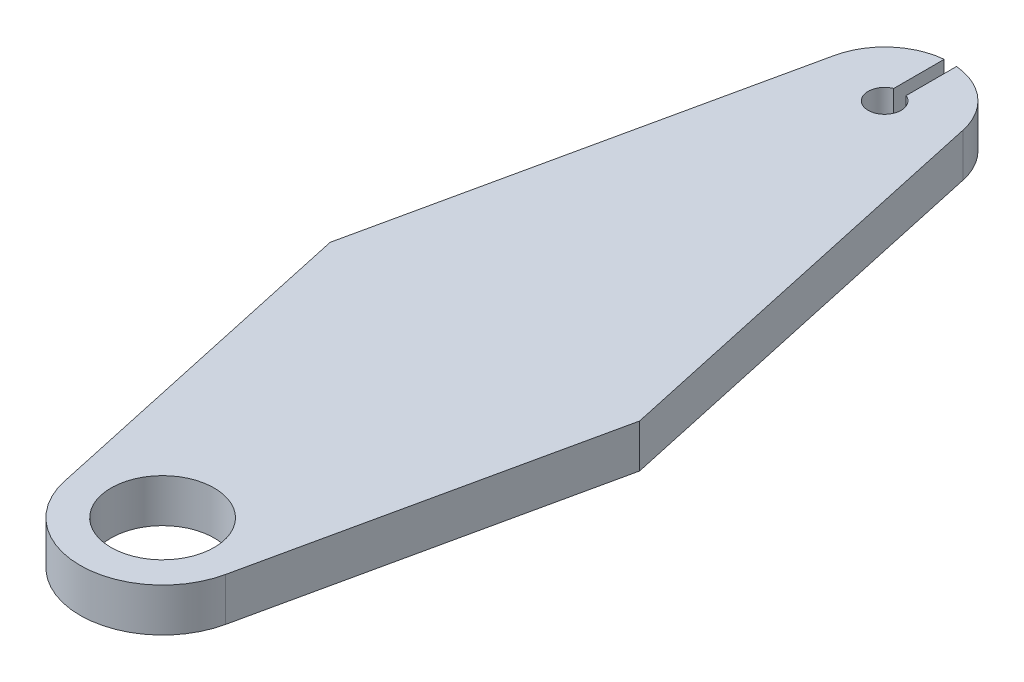
ISO-10303-21;
HEADER;
FILE_DESCRIPTION(('STEP AP214'),'2;1');
FILE_NAME('part.step','',(''),(''),'','','');
FILE_SCHEMA(('AUTOMOTIVE_DESIGN { 1 0 10303 214 1 1 1 1 }'));
ENDSEC;
DATA;
#1=APPLICATION_CONTEXT('core data for automotive mechanical design processes');
#2=APPLICATION_PROTOCOL_DEFINITION('international standard','automotive_design',2000,#1);
#3=PRODUCT_CONTEXT('',#1,'mechanical');
#4=PRODUCT('Part','Part','',(#3));
#5=PRODUCT_RELATED_PRODUCT_CATEGORY('part','',(#4));
#6=PRODUCT_DEFINITION_FORMATION('','',#4);
#7=PRODUCT_DEFINITION_CONTEXT('part definition',#1,'design');
#8=PRODUCT_DEFINITION('design','',#6,#7);
#9=PRODUCT_DEFINITION_SHAPE('','',#8);
#10=(LENGTH_UNIT() NAMED_UNIT(*) SI_UNIT(.MILLI.,.METRE.));
#11=(NAMED_UNIT(*) PLANE_ANGLE_UNIT() SI_UNIT($,.RADIAN.));
#12=(NAMED_UNIT(*) SI_UNIT($,.STERADIAN.) SOLID_ANGLE_UNIT());
#13=UNCERTAINTY_MEASURE_WITH_UNIT(LENGTH_MEASURE(1.E-05),#10,'distance_accuracy_value','');
#14=(GEOMETRIC_REPRESENTATION_CONTEXT(3) GLOBAL_UNCERTAINTY_ASSIGNED_CONTEXT((#13)) GLOBAL_UNIT_ASSIGNED_CONTEXT((#10,
#11,#12)) REPRESENTATION_CONTEXT('',''));
#15=CARTESIAN_POINT('',(0.,0.,0.));
#16=DIRECTION('',(0.,0.,1.));
#17=DIRECTION('',(1.,0.,0.));
#18=AXIS2_PLACEMENT_3D('',#15,#16,#17);
#19=CARTESIAN_POINT('',(100.,22.5,0.));
#20=DIRECTION('',(0.,1.,0.));
#21=DIRECTION('',(0.,0.,1.));
#22=AXIS2_PLACEMENT_3D('',#19,#20,#21);
#23=PLANE('',#22);
#24=CARTESIAN_POINT('',(100.,22.5,370.));
#25=DIRECTION('',(0.,-1.,0.));
#26=DIRECTION('',(0.,0.,-1.));
#27=AXIS2_PLACEMENT_3D('',#24,#25,#26);
#28=CIRCLE('',#27,12.5);
#29=CARTESIAN_POINT('',(100.,22.5,382.5));
#30=VERTEX_POINT('',#29);
#31=EDGE_CURVE('E135',#30,#30,#28,.T.);
#32=ORIENTED_EDGE('',*,*,#31,.F.);
#33=EDGE_LOOP('',(#32));
#34=FACE_BOUND('',#33,.T.);
#35=DIRECTION('',(0.,0.,1.));
#36=VECTOR('',#35,1.);
#37=CARTESIAN_POINT('',(98.5,22.5,0.));
#38=LINE('',#37,#36);
#39=CARTESIAN_POINT('',(98.5,22.5,179.070467677926));
#40=VERTEX_POINT('',#39);
#41=CARTESIAN_POINT('',(98.5,22.5,191.291900756452));
#42=VERTEX_POINT('',#41);
#43=EDGE_CURVE('E58',#40,#42,#38,.T.);
#44=ORIENTED_EDGE('',*,*,#43,.T.);
#45=CARTESIAN_POINT('',(100.,22.5,195.));
#46=DIRECTION('',(0.,-1.,0.));
#47=DIRECTION('',(0.,0.,-1.));
#48=AXIS2_PLACEMENT_3D('',#45,#46,#47);
#49=CIRCLE('',#48,4.);
#50=CARTESIAN_POINT('',(101.5,22.5,191.291900756452));
#51=VERTEX_POINT('',#50);
#52=EDGE_CURVE('E125',#51,#42,#49,.T.);
#53=ORIENTED_EDGE('',*,*,#52,.F.);
#54=DIRECTION('',(0.,0.,1.));
#55=VECTOR('',#54,1.);
#56=CARTESIAN_POINT('',(101.5,22.5,0.));
#57=LINE('',#56,#55);
#58=CARTESIAN_POINT('',(101.5,22.5,179.070467677926));
#59=VERTEX_POINT('',#58);
#60=EDGE_CURVE('E109',#59,#51,#57,.T.);
#61=ORIENTED_EDGE('',*,*,#60,.F.);
#62=CARTESIAN_POINT('',(100.,22.5,195.));
#63=DIRECTION('',(0.,1.,0.));
#64=DIRECTION('',(0.,0.,1.));
#65=AXIS2_PLACEMENT_3D('',#62,#63,#64);
#66=CIRCLE('',#65,16.);
#67=CARTESIAN_POINT('',(115.632763820398,22.5,191.591672648401));
#68=VERTEX_POINT('',#67);
#69=EDGE_CURVE('E172',#59,#68,#66,.F.);
#70=ORIENTED_EDGE('',*,*,#69,.T.);
#71=DIRECTION('',(0.213020459474943,0.,0.977047738774869));
#72=VECTOR('',#71,1.);
#73=CARTESIAN_POINT('',(137.5,22.5,291.888769533826));
#74=LINE('',#73,#72);
#75=CARTESIAN_POINT('',(137.5,22.5,291.888769533826));
#76=VERTEX_POINT('',#75);
#77=EDGE_CURVE('E140',#68,#76,#74,.T.);
#78=ORIENTED_EDGE('',*,*,#77,.T.);
#79=DIRECTION('',(-0.213020459474944,0.,0.977047738774869));
#80=VECTOR('',#79,1.);
#81=CARTESIAN_POINT('',(100.,22.5,463.887695338262));
#82=LINE('',#81,#80);
#83=CARTESIAN_POINT('',(119.540954775497,22.5,374.260409189499));
#84=VERTEX_POINT('',#83);
#85=EDGE_CURVE('E142',#76,#84,#82,.T.);
#86=ORIENTED_EDGE('',*,*,#85,.T.);
#87=CARTESIAN_POINT('',(100.,22.5,370.));
#88=DIRECTION('',(0.,1.,0.));
#89=DIRECTION('',(0.,0.,1.));
#90=AXIS2_PLACEMENT_3D('',#87,#88,#89);
#91=CIRCLE('',#90,20.);
#92=CARTESIAN_POINT('',(80.4590452245026,22.5,374.260409189499));
#93=VERTEX_POINT('',#92);
#94=EDGE_CURVE('E11',#84,#93,#91,.F.);
#95=ORIENTED_EDGE('',*,*,#94,.T.);
#96=DIRECTION('',(-0.213020459474943,0.,-0.977047738774869));
#97=VECTOR('',#96,1.);
#98=CARTESIAN_POINT('',(62.5,22.5,291.888769533826));
#99=LINE('',#98,#97);
#100=CARTESIAN_POINT('',(62.5,22.5,291.888769533826));
#101=VERTEX_POINT('',#100);
#102=EDGE_CURVE('E146',#93,#101,#99,.T.);
#103=ORIENTED_EDGE('',*,*,#102,.T.);
#104=DIRECTION('',(0.213020459474944,0.,-0.977047738774869));
#105=VECTOR('',#104,1.);
#106=CARTESIAN_POINT('',(100.,22.5,119.889843729391));
#107=LINE('',#106,#105);
#108=CARTESIAN_POINT('',(84.3672361796021,22.5,191.591672648401));
#109=VERTEX_POINT('',#108);
#110=EDGE_CURVE('E148',#101,#109,#107,.T.);
#111=ORIENTED_EDGE('',*,*,#110,.T.);
#112=EDGE_CURVE('E173',#109,#40,#66,.F.);
#113=ORIENTED_EDGE('',*,*,#112,.T.);
#114=EDGE_LOOP('',(#44,#53,#61,#70,#78,#86,#95,#103,#111,#113));
#115=FACE_BOUND('',#114,.T.);
#116=ADVANCED_FACE('F35',(#34,#115),#23,.F.);
#117=CARTESIAN_POINT('',(100.,33.,0.));
#118=DIRECTION('',(0.,1.,0.));
#119=DIRECTION('',(0.,0.,1.));
#120=AXIS2_PLACEMENT_3D('',#117,#118,#119);
#121=PLANE('',#120);
#122=CARTESIAN_POINT('',(100.,33.,370.));
#123=DIRECTION('',(0.,-1.,0.));
#124=DIRECTION('',(0.,0.,-1.));
#125=AXIS2_PLACEMENT_3D('',#122,#123,#124);
#126=CIRCLE('',#125,12.5);
#127=CARTESIAN_POINT('',(100.,33.,382.5));
#128=VERTEX_POINT('',#127);
#129=EDGE_CURVE('E117',#128,#128,#126,.T.);
#130=ORIENTED_EDGE('',*,*,#129,.T.);
#131=EDGE_LOOP('',(#130));
#132=FACE_BOUND('',#131,.T.);
#133=CARTESIAN_POINT('',(100.,33.,195.));
#134=DIRECTION('',(0.,-1.,0.));
#135=DIRECTION('',(0.,0.,-1.));
#136=AXIS2_PLACEMENT_3D('',#133,#134,#135);
#137=CIRCLE('',#136,4.);
#138=CARTESIAN_POINT('',(101.5,33.,191.291900756452));
#139=VERTEX_POINT('',#138);
#140=CARTESIAN_POINT('',(98.5,33.,191.291900756452));
#141=VERTEX_POINT('',#140);
#142=EDGE_CURVE('E127',#139,#141,#137,.T.);
#143=ORIENTED_EDGE('',*,*,#142,.T.);
#144=DIRECTION('',(0.,0.,-1.));
#145=VECTOR('',#144,1.);
#146=CARTESIAN_POINT('',(98.5,33.,0.));
#147=LINE('',#146,#145);
#148=CARTESIAN_POINT('',(98.5,33.,179.070467677926));
#149=VERTEX_POINT('',#148);
#150=EDGE_CURVE('E128',#141,#149,#147,.T.);
#151=ORIENTED_EDGE('',*,*,#150,.T.);
#152=CARTESIAN_POINT('',(100.,33.,195.));
#153=DIRECTION('',(0.,1.,0.));
#154=DIRECTION('',(0.,0.,1.));
#155=AXIS2_PLACEMENT_3D('',#152,#153,#154);
#156=CIRCLE('',#155,16.);
#157=CARTESIAN_POINT('',(84.3672361796021,33.,191.591672648401));
#158=VERTEX_POINT('',#157);
#159=EDGE_CURVE('E166',#149,#158,#156,.T.);
#160=ORIENTED_EDGE('',*,*,#159,.T.);
#161=DIRECTION('',(0.213020459474944,0.,-0.977047738774869));
#162=VECTOR('',#161,1.);
#163=CARTESIAN_POINT('',(100.,33.,119.889843729391));
#164=LINE('',#163,#162);
#165=CARTESIAN_POINT('',(62.5,33.,291.888769533826));
#166=VERTEX_POINT('',#165);
#167=EDGE_CURVE('E143',#166,#158,#164,.T.);
#168=ORIENTED_EDGE('',*,*,#167,.F.);
#169=DIRECTION('',(-0.213020459474943,0.,-0.977047738774869));
#170=VECTOR('',#169,1.);
#171=CARTESIAN_POINT('',(62.5,33.,291.888769533826));
#172=LINE('',#171,#170);
#173=CARTESIAN_POINT('',(80.4590452245026,33.,374.260409189499));
#174=VERTEX_POINT('',#173);
#175=EDGE_CURVE('E154',#174,#166,#172,.T.);
#176=ORIENTED_EDGE('',*,*,#175,.F.);
#177=CARTESIAN_POINT('',(100.,33.,370.));
#178=DIRECTION('',(0.,1.,0.));
#179=DIRECTION('',(0.,0.,1.));
#180=AXIS2_PLACEMENT_3D('',#177,#178,#179);
#181=CIRCLE('',#180,20.);
#182=CARTESIAN_POINT('',(119.540954775497,33.,374.260409189499));
#183=VERTEX_POINT('',#182);
#184=EDGE_CURVE('E178',#174,#183,#181,.T.);
#185=ORIENTED_EDGE('',*,*,#184,.T.);
#186=DIRECTION('',(-0.213020459474944,0.,0.977047738774869));
#187=VECTOR('',#186,1.);
#188=CARTESIAN_POINT('',(100.,33.,463.887695338262));
#189=LINE('',#188,#187);
#190=CARTESIAN_POINT('',(137.5,33.,291.888769533826));
#191=VERTEX_POINT('',#190);
#192=EDGE_CURVE('E133',#191,#183,#189,.T.);
#193=ORIENTED_EDGE('',*,*,#192,.F.);
#194=DIRECTION('',(0.213020459474943,0.,0.977047738774869));
#195=VECTOR('',#194,1.);
#196=CARTESIAN_POINT('',(137.5,33.,291.888769533826));
#197=LINE('',#196,#195);
#198=CARTESIAN_POINT('',(115.632763820398,33.,191.591672648401));
#199=VERTEX_POINT('',#198);
#200=EDGE_CURVE('E131',#199,#191,#197,.T.);
#201=ORIENTED_EDGE('',*,*,#200,.F.);
#202=CARTESIAN_POINT('',(101.5,33.,179.070467677926));
#203=VERTEX_POINT('',#202);
#204=EDGE_CURVE('E167',#199,#203,#156,.T.);
#205=ORIENTED_EDGE('',*,*,#204,.T.);
#206=DIRECTION('',(0.,0.,-1.));
#207=VECTOR('',#206,1.);
#208=CARTESIAN_POINT('',(101.5,33.,0.));
#209=LINE('',#208,#207);
#210=EDGE_CURVE('E50',#139,#203,#209,.T.);
#211=ORIENTED_EDGE('',*,*,#210,.F.);
#212=EDGE_LOOP('',(#143,#151,#160,#168,#176,#185,#193,#201,#205,#211));
#213=FACE_BOUND('',#212,.T.);
#214=ADVANCED_FACE('F196',(#132,#213),#121,.T.);
#215=CARTESIAN_POINT('',(100.,22.5,195.));
#216=DIRECTION('',(0.,1.,0.));
#217=DIRECTION('',(0.,0.,1.));
#218=AXIS2_PLACEMENT_3D('',#215,#216,#217);
#219=CYLINDRICAL_SURFACE('',#218,4.);
#220=ORIENTED_EDGE('',*,*,#52,.T.);
#221=DIRECTION('',(0.,1.,0.));
#222=VECTOR('',#221,1.);
#223=CARTESIAN_POINT('',(98.5,-12.001,191.291900756452));
#224=LINE('',#223,#222);
#225=EDGE_CURVE('E118',#42,#141,#224,.T.);
#226=ORIENTED_EDGE('',*,*,#225,.T.);
#227=ORIENTED_EDGE('',*,*,#142,.F.);
#228=DIRECTION('',(0.,1.,0.));
#229=VECTOR('',#228,1.);
#230=CARTESIAN_POINT('',(101.5,-12.001,191.291900756452));
#231=LINE('',#230,#229);
#232=EDGE_CURVE('E112',#51,#139,#231,.T.);
#233=ORIENTED_EDGE('',*,*,#232,.F.);
#234=EDGE_LOOP('',(#220,#226,#227,#233));
#235=FACE_BOUND('',#234,.T.);
#236=ADVANCED_FACE('F123',(#235),#219,.F.);
#237=CARTESIAN_POINT('',(100.,22.5,195.));
#238=DIRECTION('',(0.,1.,0.));
#239=DIRECTION('',(0.,0.,1.));
#240=AXIS2_PLACEMENT_3D('',#237,#238,#239);
#241=CYLINDRICAL_SURFACE('',#240,16.);
#242=ORIENTED_EDGE('',*,*,#159,.F.);
#243=DIRECTION('',(0.,1.,0.));
#244=VECTOR('',#243,1.);
#245=CARTESIAN_POINT('',(98.5,-12.001,179.070467677926));
#246=LINE('',#245,#244);
#247=EDGE_CURVE('E206',#40,#149,#246,.T.);
#248=ORIENTED_EDGE('',*,*,#247,.F.);
#249=ORIENTED_EDGE('',*,*,#112,.F.);
#250=DIRECTION('',(0.,1.,0.));
#251=VECTOR('',#250,1.);
#252=CARTESIAN_POINT('',(84.3672361796021,22.5,191.591672648401));
#253=LINE('',#252,#251);
#254=EDGE_CURVE('E170',#158,#109,#253,.F.);
#255=ORIENTED_EDGE('',*,*,#254,.F.);
#256=EDGE_LOOP('',(#242,#248,#249,#255));
#257=FACE_BOUND('',#256,.T.);
#258=ADVANCED_FACE('F205',(#257),#241,.T.);
#259=CARTESIAN_POINT('',(137.5,22.5,291.888769533826));
#260=DIRECTION('',(-0.977047738774869,0.,0.213020459474943));
#261=DIRECTION('',(0.213020459474944,0.,0.977047738774869));
#262=AXIS2_PLACEMENT_3D('',#259,#260,#261);
#263=PLANE('',#262);
#264=ORIENTED_EDGE('',*,*,#77,.F.);
#265=DIRECTION('',(0.,1.,0.));
#266=VECTOR('',#265,1.);
#267=CARTESIAN_POINT('',(115.632763820398,22.5,191.591672648401));
#268=LINE('',#267,#266);
#269=EDGE_CURVE('E163',#68,#199,#268,.T.);
#270=ORIENTED_EDGE('',*,*,#269,.T.);
#271=ORIENTED_EDGE('',*,*,#200,.T.);
#272=DIRECTION('',(0.,1.,0.));
#273=VECTOR('',#272,1.);
#274=CARTESIAN_POINT('',(137.5,22.5,291.888769533826));
#275=LINE('',#274,#273);
#276=EDGE_CURVE('E160',#76,#191,#275,.T.);
#277=ORIENTED_EDGE('',*,*,#276,.F.);
#278=EDGE_LOOP('',(#264,#270,#271,#277));
#279=FACE_BOUND('',#278,.T.);
#280=ADVANCED_FACE('F242',(#279),#263,.F.);
#281=CARTESIAN_POINT('',(100.,22.5,463.887695338262));
#282=DIRECTION('',(-0.977047738774869,0.,-0.213020459474944));
#283=DIRECTION('',(-0.213020459474944,0.,0.977047738774869));
#284=AXIS2_PLACEMENT_3D('',#281,#282,#283);
#285=PLANE('',#284);
#286=ORIENTED_EDGE('',*,*,#192,.T.);
#287=DIRECTION('',(0.,1.,0.));
#288=VECTOR('',#287,1.);
#289=CARTESIAN_POINT('',(119.540954775497,22.5,374.260409189499));
#290=LINE('',#289,#288);
#291=EDGE_CURVE('E43',#183,#84,#290,.F.);
#292=ORIENTED_EDGE('',*,*,#291,.T.);
#293=ORIENTED_EDGE('',*,*,#85,.F.);
#294=ORIENTED_EDGE('',*,*,#276,.T.);
#295=EDGE_LOOP('',(#286,#292,#293,#294));
#296=FACE_BOUND('',#295,.T.);
#297=ADVANCED_FACE('F182',(#296),#285,.F.);
#298=CARTESIAN_POINT('',(62.5,22.5,291.888769533826));
#299=DIRECTION('',(0.977047738774869,0.,-0.213020459474943));
#300=DIRECTION('',(-0.213020459474944,0.,-0.977047738774869));
#301=AXIS2_PLACEMENT_3D('',#298,#299,#300);
#302=PLANE('',#301);
#303=ORIENTED_EDGE('',*,*,#102,.F.);
#304=DIRECTION('',(0.,1.,0.));
#305=VECTOR('',#304,1.);
#306=CARTESIAN_POINT('',(80.4590452245026,22.5,374.260409189499));
#307=LINE('',#306,#305);
#308=EDGE_CURVE('E175',#93,#174,#307,.T.);
#309=ORIENTED_EDGE('',*,*,#308,.T.);
#310=ORIENTED_EDGE('',*,*,#175,.T.);
#311=DIRECTION('',(0.,1.,0.));
#312=VECTOR('',#311,1.);
#313=CARTESIAN_POINT('',(62.5,22.5,291.888769533826));
#314=LINE('',#313,#312);
#315=EDGE_CURVE('E150',#101,#166,#314,.T.);
#316=ORIENTED_EDGE('',*,*,#315,.F.);
#317=EDGE_LOOP('',(#303,#309,#310,#316));
#318=FACE_BOUND('',#317,.T.);
#319=ADVANCED_FACE('F192',(#318),#302,.F.);
#320=CARTESIAN_POINT('',(100.,22.5,119.889843729391));
#321=DIRECTION('',(0.977047738774869,0.,0.213020459474944));
#322=DIRECTION('',(0.213020459474944,0.,-0.977047738774869));
#323=AXIS2_PLACEMENT_3D('',#320,#321,#322);
#324=PLANE('',#323);
#325=ORIENTED_EDGE('',*,*,#167,.T.);
#326=ORIENTED_EDGE('',*,*,#254,.T.);
#327=ORIENTED_EDGE('',*,*,#110,.F.);
#328=ORIENTED_EDGE('',*,*,#315,.T.);
#329=EDGE_LOOP('',(#325,#326,#327,#328));
#330=FACE_BOUND('',#329,.T.);
#331=ADVANCED_FACE('F201',(#330),#324,.F.);
#332=CARTESIAN_POINT('',(100.,22.5,370.));
#333=DIRECTION('',(0.,1.,0.));
#334=DIRECTION('',(0.,0.,1.));
#335=AXIS2_PLACEMENT_3D('',#332,#333,#334);
#336=CYLINDRICAL_SURFACE('',#335,12.5);
#337=CARTESIAN_POINT('',(100.,22.5,382.5));
#338=CARTESIAN_POINT('',(100.,22.609375,382.5));
#339=CARTESIAN_POINT('',(100.,22.71875,382.5));
#340=CARTESIAN_POINT('',(100.,22.9375,382.5));
#341=CARTESIAN_POINT('',(100.,23.046875,382.5));
#342=CARTESIAN_POINT('',(100.,23.265625,382.5));
#343=CARTESIAN_POINT('',(100.,23.375,382.5));
#344=CARTESIAN_POINT('',(100.,23.59375,382.5));
#345=CARTESIAN_POINT('',(100.,23.703125,382.5));
#346=CARTESIAN_POINT('',(100.,23.921875,382.5));
#347=CARTESIAN_POINT('',(100.,24.03125,382.5));
#348=CARTESIAN_POINT('',(100.,24.25,382.5));
#349=CARTESIAN_POINT('',(100.,24.359375,382.5));
#350=CARTESIAN_POINT('',(100.,24.578125,382.5));
#351=CARTESIAN_POINT('',(100.,24.6875,382.5));
#352=CARTESIAN_POINT('',(100.,24.90625,382.5));
#353=CARTESIAN_POINT('',(100.,25.015625,382.5));
#354=CARTESIAN_POINT('',(100.,25.234375,382.5));
#355=CARTESIAN_POINT('',(100.,25.34375,382.5));
#356=CARTESIAN_POINT('',(100.,25.5625,382.5));
#357=CARTESIAN_POINT('',(100.,25.671875,382.5));
#358=CARTESIAN_POINT('',(100.,25.890625,382.5));
#359=CARTESIAN_POINT('',(100.,26.,382.5));
#360=CARTESIAN_POINT('',(100.,26.21875,382.5));
#361=CARTESIAN_POINT('',(100.,26.328125,382.5));
#362=CARTESIAN_POINT('',(100.,26.546875,382.5));
#363=CARTESIAN_POINT('',(100.,26.65625,382.5));
#364=CARTESIAN_POINT('',(100.,26.875,382.5));
#365=CARTESIAN_POINT('',(100.,26.984375,382.5));
#366=CARTESIAN_POINT('',(100.,27.203125,382.5));
#367=CARTESIAN_POINT('',(100.,27.3125,382.5));
#368=CARTESIAN_POINT('',(100.,27.53125,382.5));
#369=CARTESIAN_POINT('',(100.,27.640625,382.5));
#370=CARTESIAN_POINT('',(100.,27.859375,382.5));
#371=CARTESIAN_POINT('',(100.,27.96875,382.5));
#372=CARTESIAN_POINT('',(100.,28.1875,382.5));
#373=CARTESIAN_POINT('',(100.,28.296875,382.5));
#374=CARTESIAN_POINT('',(100.,28.515625,382.5));
#375=CARTESIAN_POINT('',(100.,28.625,382.5));
#376=CARTESIAN_POINT('',(100.,28.84375,382.5));
#377=CARTESIAN_POINT('',(100.,28.953125,382.5));
#378=CARTESIAN_POINT('',(100.,29.171875,382.5));
#379=CARTESIAN_POINT('',(100.,29.28125,382.5));
#380=CARTESIAN_POINT('',(100.,29.5,382.5));
#381=CARTESIAN_POINT('',(100.,29.609375,382.5));
#382=CARTESIAN_POINT('',(100.,29.828125,382.5));
#383=CARTESIAN_POINT('',(100.,29.9375,382.5));
#384=CARTESIAN_POINT('',(100.,30.15625,382.5));
#385=CARTESIAN_POINT('',(100.,30.265625,382.5));
#386=CARTESIAN_POINT('',(100.,30.484375,382.5));
#387=CARTESIAN_POINT('',(100.,30.59375,382.5));
#388=CARTESIAN_POINT('',(100.,30.8125,382.5));
#389=CARTESIAN_POINT('',(100.,30.921875,382.5));
#390=CARTESIAN_POINT('',(100.,31.140625,382.5));
#391=CARTESIAN_POINT('',(100.,31.25,382.5));
#392=CARTESIAN_POINT('',(100.,31.46875,382.5));
#393=CARTESIAN_POINT('',(100.,31.578125,382.5));
#394=CARTESIAN_POINT('',(100.,31.796875,382.5));
#395=CARTESIAN_POINT('',(100.,31.90625,382.5));
#396=CARTESIAN_POINT('',(100.,32.125,382.5));
#397=CARTESIAN_POINT('',(100.,32.234375,382.5));
#398=CARTESIAN_POINT('',(100.,32.453125,382.5));
#399=CARTESIAN_POINT('',(100.,32.5625,382.5));
#400=CARTESIAN_POINT('',(100.,32.78125,382.5));
#401=CARTESIAN_POINT('',(100.,32.890625,382.5));
#402=CARTESIAN_POINT('',(100.,33.,382.5));
#403=B_SPLINE_CURVE_WITH_KNOTS('',3,(#337,#338,#339,#340,#341,#342,#343,#344,#345,#346,#347,
#348,#349,#350,#351,#352,#353,#354,#355,#356,#357,#358,#359,#360,#361,#362,#363,#364,#365,#366,
#367,#368,#369,#370,#371,#372,#373,#374,#375,#376,#377,#378,#379,#380,#381,#382,#383,#384,#385,
#386,#387,#388,#389,#390,#391,#392,#393,#394,#395,#396,#397,#398,#399,#400,#401,#402),
.UNSPECIFIED.,.F.,.F.,(4,2,2,2,2,2,2,2,2,2,2,2,2,2,2,2,2,2,2,2,2,2,2,2,2,2,2,2,2,2,2,2,4),(0.,
0.328124999999999,0.656249999999997,0.984374999999999,1.3125,1.640625,1.96875,2.296875,2.625,
2.953125,3.28125,3.609375,3.9375,4.265625,4.59375,4.921875,5.25,5.578125,5.90625,6.234375,
6.56250000000001,6.890625,7.21875,7.54687500000001,7.87500000000001,8.20312500000001,8.53125,
8.85937500000001,9.18750000000001,9.51562500000001,9.84375000000001,10.171875,10.5),.UNSPECIFIED.);
#404=EDGE_CURVE('BSEAM218',#30,#128,#403,.T.);
#405=ORIENTED_EDGE('',*,*,#31,.T.);
#406=ORIENTED_EDGE('',*,*,#129,.F.);
#407=ORIENTED_EDGE('',*,*,#404,.T.);
#408=ORIENTED_EDGE('',*,*,#404,.F.);
#409=EDGE_LOOP('',(#405,#407,#406,#408));
#410=FACE_BOUND('',#409,.T.);
#411=ADVANCED_FACE('F218',(#410),#336,.F.);
#412=DIRECTION('',(0.,1.,0.));
#413=VECTOR('',#412,1.);
#414=CARTESIAN_POINT('',(101.5,-12.001,179.070467677926));
#415=LINE('',#414,#413);
#416=EDGE_CURVE('E113',#59,#203,#415,.T.);
#417=ORIENTED_EDGE('',*,*,#416,.T.);
#418=ORIENTED_EDGE('',*,*,#204,.F.);
#419=ORIENTED_EDGE('',*,*,#269,.F.);
#420=ORIENTED_EDGE('',*,*,#69,.F.);
#421=EDGE_LOOP('',(#417,#418,#419,#420));
#422=FACE_BOUND('',#421,.T.);
#423=ADVANCED_FACE('F220',(#422),#241,.T.);
#424=CARTESIAN_POINT('',(100.,22.5,370.));
#425=DIRECTION('',(0.,1.,0.));
#426=DIRECTION('',(0.,0.,1.));
#427=AXIS2_PLACEMENT_3D('',#424,#425,#426);
#428=CYLINDRICAL_SURFACE('',#427,20.);
#429=ORIENTED_EDGE('',*,*,#94,.F.);
#430=ORIENTED_EDGE('',*,*,#291,.F.);
#431=ORIENTED_EDGE('',*,*,#184,.F.);
#432=ORIENTED_EDGE('',*,*,#308,.F.);
#433=EDGE_LOOP('',(#429,#430,#431,#432));
#434=FACE_BOUND('',#433,.T.);
#435=ADVANCED_FACE('F37',(#434),#428,.T.);
#436=CARTESIAN_POINT('',(101.5,-12.001,0.));
#437=DIRECTION('',(1.,0.,0.));
#438=DIRECTION('',(0.,0.,-1.));
#439=AXIS2_PLACEMENT_3D('',#436,#437,#438);
#440=PLANE('',#439);
#441=ORIENTED_EDGE('',*,*,#60,.T.);
#442=ORIENTED_EDGE('',*,*,#232,.T.);
#443=ORIENTED_EDGE('',*,*,#210,.T.);
#444=ORIENTED_EDGE('',*,*,#416,.F.);
#445=EDGE_LOOP('',(#441,#442,#443,#444));
#446=FACE_BOUND('',#445,.T.);
#447=ADVANCED_FACE('F111',(#446),#440,.F.);
#448=CARTESIAN_POINT('',(98.5,-12.001,0.));
#449=DIRECTION('',(1.,0.,0.));
#450=DIRECTION('',(0.,0.,-1.));
#451=AXIS2_PLACEMENT_3D('',#448,#449,#450);
#452=PLANE('',#451);
#453=ORIENTED_EDGE('',*,*,#247,.T.);
#454=ORIENTED_EDGE('',*,*,#150,.F.);
#455=ORIENTED_EDGE('',*,*,#225,.F.);
#456=ORIENTED_EDGE('',*,*,#43,.F.);
#457=EDGE_LOOP('',(#453,#454,#455,#456));
#458=FACE_BOUND('',#457,.T.);
#459=ADVANCED_FACE('F252',(#458),#452,.T.);
#460=CLOSED_SHELL('',(#116,#214,#236,#258,#280,#297,#319,#331,#411,#423,#435,#447,#459));
#461=MANIFOLD_SOLID_BREP('B2',#460);
#462=ADVANCED_BREP_SHAPE_REPRESENTATION('',(#18,#461),#14);
#463=SHAPE_DEFINITION_REPRESENTATION(#9,#462);
ENDSEC;
END-ISO-10303-21;
